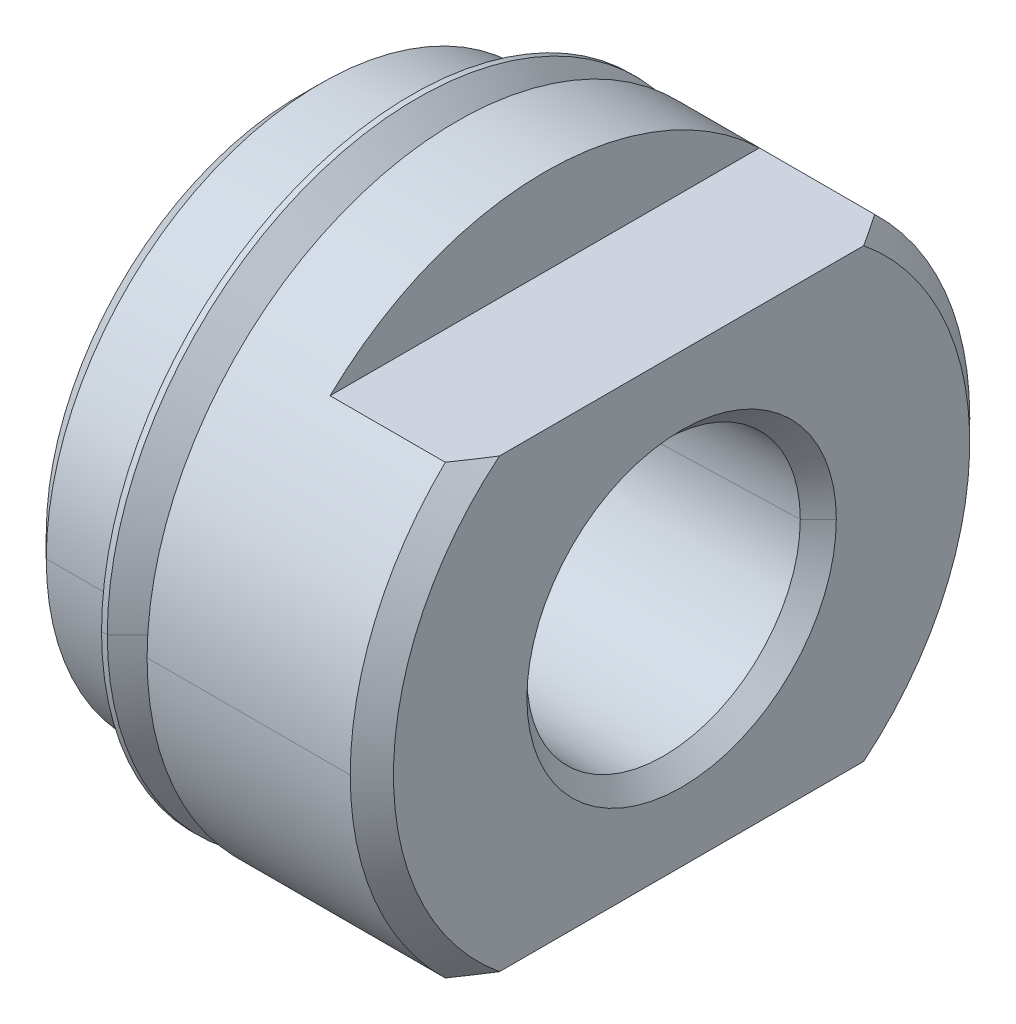
ISO-10303-21;
HEADER;
FILE_DESCRIPTION(('STEP AP214'),'2;1');
FILE_NAME('part.step','',(''),(''),'','','');
FILE_SCHEMA(('AUTOMOTIVE_DESIGN { 1 0 10303 214 1 1 1 1 }'));
ENDSEC;
DATA;
#1=APPLICATION_CONTEXT('core data for automotive mechanical design processes');
#2=APPLICATION_PROTOCOL_DEFINITION('international standard','automotive_design',2000,#1);
#3=PRODUCT_CONTEXT('',#1,'mechanical');
#4=PRODUCT('Part','Part','',(#3));
#5=PRODUCT_RELATED_PRODUCT_CATEGORY('part','',(#4));
#6=PRODUCT_DEFINITION_FORMATION('','',#4);
#7=PRODUCT_DEFINITION_CONTEXT('part definition',#1,'design');
#8=PRODUCT_DEFINITION('design','',#6,#7);
#9=PRODUCT_DEFINITION_SHAPE('','',#8);
#10=(LENGTH_UNIT() NAMED_UNIT(*) SI_UNIT(.MILLI.,.METRE.));
#11=(NAMED_UNIT(*) PLANE_ANGLE_UNIT() SI_UNIT($,.RADIAN.));
#12=(NAMED_UNIT(*) SI_UNIT($,.STERADIAN.) SOLID_ANGLE_UNIT());
#13=UNCERTAINTY_MEASURE_WITH_UNIT(LENGTH_MEASURE(1.E-05),#10,'distance_accuracy_value','');
#14=(GEOMETRIC_REPRESENTATION_CONTEXT(3) GLOBAL_UNCERTAINTY_ASSIGNED_CONTEXT((#13)) GLOBAL_UNIT_ASSIGNED_CONTEXT((#10,
#11,#12)) REPRESENTATION_CONTEXT('',''));
#15=CARTESIAN_POINT('',(0.,0.,0.));
#16=DIRECTION('',(0.,0.,1.));
#17=DIRECTION('',(1.,0.,0.));
#18=AXIS2_PLACEMENT_3D('',#15,#16,#17);
#19=CARTESIAN_POINT('',(8.6614,-7.874,21.844));
#20=DIRECTION('',(0.,-1.,0.));
#21=DIRECTION('',(0.,0.,-1.));
#22=AXIS2_PLACEMENT_3D('',#19,#20,#21);
#23=PLANE('',#22);
#24=DIRECTION('',(1.,0.,0.));
#25=VECTOR('',#24,1.);
#26=CARTESIAN_POINT('',(13.4874,-7.874,-7.56902952828169));
#27=LINE('',#26,#25);
#28=CARTESIAN_POINT('',(8.6614,-7.874,-7.56902952828169));
#29=VERTEX_POINT('',#28);
#30=CARTESIAN_POINT('',(12.7254,-7.874,-7.56902952828169));
#31=VERTEX_POINT('',#30);
#32=EDGE_CURVE('E11',#29,#31,#27,.T.);
#33=ORIENTED_EDGE('',*,*,#32,.T.);
#34=CARTESIAN_POINT('',(12.7254,-7.874,-7.56902952828168));
#35=CARTESIAN_POINT('',(12.9869753290344,-7.874,-7.19158011643322));
#36=CARTESIAN_POINT('',(13.2417852351289,-7.874,-6.80938092440114));
#37=CARTESIAN_POINT('',(13.4874,-7.874,-6.42072612716039));
#38=B_SPLINE_CURVE_WITH_KNOTS('',3,(#34,#35,#36,#37),.UNSPECIFIED.,.F.,.F.,(4,4),
(0.0200657069150868,0.0214499738718816),.UNSPECIFIED.);
#39=CARTESIAN_POINT('',(13.4874,-7.874,-6.42072612716039));
#40=VERTEX_POINT('',#39);
#41=EDGE_CURVE('E26',#31,#40,#38,.T.);
#42=ORIENTED_EDGE('',*,*,#41,.T.);
#43=DIRECTION('',(0.,0.,1.));
#44=VECTOR('',#43,1.);
#45=CARTESIAN_POINT('',(13.4874,-7.874,0.));
#46=LINE('',#45,#44);
#47=CARTESIAN_POINT('',(13.4874,-7.874,6.42072612716039));
#48=VERTEX_POINT('',#47);
#49=EDGE_CURVE('E182',#40,#48,#46,.T.);
#50=ORIENTED_EDGE('',*,*,#49,.T.);
#51=CARTESIAN_POINT('',(13.4874,-7.874,6.42072612716039));
#52=CARTESIAN_POINT('',(13.2416658865126,-7.874,6.80956977873295));
#53=CARTESIAN_POINT('',(12.9865070268508,-7.874,7.19225586970244));
#54=CARTESIAN_POINT('',(12.7254,-7.874,7.56902952828169));
#55=B_SPLINE_CURVE_WITH_KNOTS('',3,(#51,#52,#53,#54),.UNSPECIFIED.,.F.,.F.,(4,4),
(0.0351109925995823,0.0364702615939391),.UNSPECIFIED.);
#56=CARTESIAN_POINT('',(12.7254,-7.874,7.56902952828169));
#57=VERTEX_POINT('',#56);
#58=EDGE_CURVE('E1046',#48,#57,#55,.T.);
#59=ORIENTED_EDGE('',*,*,#58,.T.);
#60=DIRECTION('',(1.,0.,0.));
#61=VECTOR('',#60,1.);
#62=CARTESIAN_POINT('',(13.4874,-7.874,7.56902952828169));
#63=LINE('',#62,#61);
#64=CARTESIAN_POINT('',(8.6614,-7.874,7.56902952828169));
#65=VERTEX_POINT('',#64);
#66=EDGE_CURVE('E1041',#65,#57,#63,.T.);
#67=ORIENTED_EDGE('',*,*,#66,.F.);
#68=DIRECTION('',(0.,0.,-1.));
#69=VECTOR('',#68,1.);
#70=CARTESIAN_POINT('',(8.6614,-7.874,21.844));
#71=LINE('',#70,#69);
#72=EDGE_CURVE('E1037',#65,#29,#71,.T.);
#73=ORIENTED_EDGE('',*,*,#72,.T.);
#74=EDGE_LOOP('',(#33,#42,#50,#59,#67,#73));
#75=FACE_BOUND('',#74,.T.);
#76=ADVANCED_FACE('F17',(#75),#23,.T.);
#77=CARTESIAN_POINT('',(8.6614,0.,0.));
#78=DIRECTION('',(1.,0.,0.));
#79=DIRECTION('',(0.,0.,-1.));
#80=AXIS2_PLACEMENT_3D('',#77,#78,#79);
#81=PLANE('',#80);
#82=CARTESIAN_POINT('',(8.6614,0.,0.));
#83=DIRECTION('',(1.,0.,0.));
#84=DIRECTION('',(0.,0.,-1.));
#85=AXIS2_PLACEMENT_3D('',#82,#83,#84);
#86=CIRCLE('',#85,10.922);
#87=EDGE_CURVE('E1032',#65,#29,#86,.T.);
#88=ORIENTED_EDGE('',*,*,#87,.T.);
#89=ORIENTED_EDGE('',*,*,#72,.F.);
#90=EDGE_LOOP('',(#88,#89));
#91=FACE_BOUND('',#90,.T.);
#92=ADVANCED_FACE('F1118',(#91),#81,.T.);
#93=CARTESIAN_POINT('',(13.4874,0.,0.));
#94=DIRECTION('',(-1.,0.,0.));
#95=DIRECTION('',(0.,1.,0.));
#96=AXIS2_PLACEMENT_3D('',#93,#94,#95);
#97=CYLINDRICAL_SURFACE('',#96,10.922);
#98=CARTESIAN_POINT('',(5.5626,0.,0.));
#99=DIRECTION('',(1.,0.,0.));
#100=DIRECTION('',(0.,0.,-1.));
#101=AXIS2_PLACEMENT_3D('',#98,#99,#100);
#102=CIRCLE('',#101,10.922);
#103=CARTESIAN_POINT('',(5.5626,0.,10.922));
#104=VERTEX_POINT('',#103);
#105=CARTESIAN_POINT('',(5.5626,0.,-10.922));
#106=VERTEX_POINT('',#105);
#107=EDGE_CURVE('E1030',#104,#106,#102,.T.);
#108=ORIENTED_EDGE('',*,*,#107,.T.);
#109=CARTESIAN_POINT('',(12.7254,0.,-10.922));
#110=DIRECTION('',(-1.,0.,0.));
#111=VECTOR('',#110,1.);
#112=LINE('',#109,#111);
#113=CARTESIAN_POINT('',(12.7254,0.,-10.922));
#114=VERTEX_POINT('',#113);
#115=EDGE_CURVE('E978',#114,#106,#112,.T.);
#116=ORIENTED_EDGE('',*,*,#115,.F.);
#117=CARTESIAN_POINT('',(12.7254,0.,0.));
#118=DIRECTION('',(1.,0.,0.));
#119=DIRECTION('',(0.,0.,-1.));
#120=AXIS2_PLACEMENT_3D('',#117,#118,#119);
#121=CIRCLE('',#120,10.922);
#122=EDGE_CURVE('E1015',#31,#114,#121,.T.);
#123=ORIENTED_EDGE('',*,*,#122,.F.);
#124=ORIENTED_EDGE('',*,*,#32,.F.);
#125=ORIENTED_EDGE('',*,*,#87,.F.);
#126=ORIENTED_EDGE('',*,*,#66,.T.);
#127=CARTESIAN_POINT('',(12.7254,0.,0.));
#128=DIRECTION('',(1.,0.,0.));
#129=DIRECTION('',(0.,0.,-1.));
#130=AXIS2_PLACEMENT_3D('',#127,#128,#129);
#131=CIRCLE('',#130,10.922);
#132=CARTESIAN_POINT('',(12.7254,0.,10.922));
#133=VERTEX_POINT('',#132);
#134=EDGE_CURVE('E1012',#133,#57,#131,.T.);
#135=ORIENTED_EDGE('',*,*,#134,.F.);
#136=CARTESIAN_POINT('',(12.7254,0.,10.922));
#137=DIRECTION('',(-1.,0.,0.));
#138=VECTOR('',#137,1.);
#139=LINE('',#136,#138);
#140=EDGE_CURVE('E999',#133,#104,#139,.T.);
#141=ORIENTED_EDGE('',*,*,#140,.T.);
#142=EDGE_LOOP('',(#108,#116,#123,#124,#125,#126,#135,#141));
#143=FACE_BOUND('',#142,.T.);
#144=ADVANCED_FACE('F960',(#143),#97,.T.);
#145=CARTESIAN_POINT('',(13.4874,0.,0.));
#146=DIRECTION('',(-1.,0.,0.));
#147=DIRECTION('',(0.,-1.,0.));
#148=AXIS2_PLACEMENT_3D('',#145,#146,#147);
#149=CYLINDRICAL_SURFACE('',#148,10.922);
#150=CARTESIAN_POINT('',(12.7254,0.,0.));
#151=DIRECTION('',(1.,0.,0.));
#152=DIRECTION('',(0.,0.,-1.));
#153=AXIS2_PLACEMENT_3D('',#150,#151,#152);
#154=CIRCLE('',#153,10.922);
#155=CARTESIAN_POINT('',(12.7254,7.874,7.56902952828169));
#156=VERTEX_POINT('',#155);
#157=EDGE_CURVE('E994',#156,#133,#154,.T.);
#158=ORIENTED_EDGE('',*,*,#157,.F.);
#159=DIRECTION('',(1.,0.,0.));
#160=VECTOR('',#159,1.);
#161=CARTESIAN_POINT('',(13.4874,7.874,7.56902952828169));
#162=LINE('',#161,#160);
#163=CARTESIAN_POINT('',(8.6614,7.874,7.56902952828169));
#164=VERTEX_POINT('',#163);
#165=EDGE_CURVE('E990',#164,#156,#162,.T.);
#166=ORIENTED_EDGE('',*,*,#165,.F.);
#167=CARTESIAN_POINT('',(8.6614,0.,0.));
#168=DIRECTION('',(1.,0.,0.));
#169=DIRECTION('',(0.,0.,-1.));
#170=AXIS2_PLACEMENT_3D('',#167,#168,#169);
#171=CIRCLE('',#170,10.922);
#172=CARTESIAN_POINT('',(8.6614,7.874,-7.56902952828169));
#173=VERTEX_POINT('',#172);
#174=EDGE_CURVE('E985',#173,#164,#171,.T.);
#175=ORIENTED_EDGE('',*,*,#174,.F.);
#176=DIRECTION('',(1.,0.,0.));
#177=VECTOR('',#176,1.);
#178=CARTESIAN_POINT('',(13.4874,7.874,-7.56902952828169));
#179=LINE('',#178,#177);
#180=CARTESIAN_POINT('',(12.7254,7.874,-7.56902952828169));
#181=VERTEX_POINT('',#180);
#182=EDGE_CURVE('E981',#173,#181,#179,.T.);
#183=ORIENTED_EDGE('',*,*,#182,.T.);
#184=CARTESIAN_POINT('',(12.7254,0.,0.));
#185=DIRECTION('',(1.,0.,0.));
#186=DIRECTION('',(0.,0.,-1.));
#187=AXIS2_PLACEMENT_3D('',#184,#185,#186);
#188=CIRCLE('',#187,10.922);
#189=EDGE_CURVE('E193',#114,#181,#188,.T.);
#190=ORIENTED_EDGE('',*,*,#189,.F.);
#191=ORIENTED_EDGE('',*,*,#115,.T.);
#192=CARTESIAN_POINT('',(5.5626,0.,0.));
#193=DIRECTION('',(1.,0.,0.));
#194=DIRECTION('',(0.,0.,-1.));
#195=AXIS2_PLACEMENT_3D('',#192,#193,#194);
#196=CIRCLE('',#195,10.922);
#197=EDGE_CURVE('E941',#106,#104,#196,.T.);
#198=ORIENTED_EDGE('',*,*,#197,.T.);
#199=ORIENTED_EDGE('',*,*,#140,.F.);
#200=EDGE_LOOP('',(#158,#166,#175,#183,#190,#191,#198,#199));
#201=FACE_BOUND('',#200,.T.);
#202=ADVANCED_FACE('F950',(#201),#149,.T.);
#203=CARTESIAN_POINT('',(5.5626,8.9154,0.));
#204=DIRECTION('',(1.,0.,0.));
#205=DIRECTION('',(0.,0.,-1.));
#206=AXIS2_PLACEMENT_3D('',#203,#204,#205);
#207=PLANE('',#206);
#208=ORIENTED_EDGE('',*,*,#197,.F.);
#209=ORIENTED_EDGE('',*,*,#107,.F.);
#210=EDGE_LOOP('',(#208,#209));
#211=FACE_BOUND('',#210,.T.);
#212=CARTESIAN_POINT('',(5.5626,0.,0.));
#213=DIRECTION('',(1.,0.,0.));
#214=DIRECTION('',(0.,0.,-1.));
#215=AXIS2_PLACEMENT_3D('',#212,#213,#214);
#216=CIRCLE('',#215,9.51839893040249);
#217=CARTESIAN_POINT('',(5.5626,0.,-9.51839893040249));
#218=VERTEX_POINT('',#217);
#219=CARTESIAN_POINT('',(5.5626,0.,9.51839893040249));
#220=VERTEX_POINT('',#219);
#221=EDGE_CURVE('E937',#218,#220,#216,.T.);
#222=ORIENTED_EDGE('',*,*,#221,.T.);
#223=CARTESIAN_POINT('',(5.5626,0.,0.));
#224=DIRECTION('',(1.,0.,0.));
#225=DIRECTION('',(0.,0.,-1.));
#226=AXIS2_PLACEMENT_3D('',#223,#224,#225);
#227=CIRCLE('',#226,9.51839893040249);
#228=EDGE_CURVE('E933',#220,#218,#227,.T.);
#229=ORIENTED_EDGE('',*,*,#228,.T.);
#230=EDGE_LOOP('',(#222,#229));
#231=FACE_BOUND('',#230,.T.);
#232=ADVANCED_FACE('F959',(#211,#231),#207,.F.);
#233=CARTESIAN_POINT('',(6.1655989304025,0.,0.));
#234=DIRECTION('',(-1.,0.,0.));
#235=DIRECTION('',(0.,1.,0.));
#236=AXIS2_PLACEMENT_3D('',#233,#234,#235);
#237=CONICAL_SURFACE('',#236,8.9154,0.785398163397449);
#238=CARTESIAN_POINT('',(4.1589989304025,0.,0.));
#239=DIRECTION('',(1.,0.,0.));
#240=DIRECTION('',(0.,0.,-1.));
#241=AXIS2_PLACEMENT_3D('',#238,#239,#240);
#242=CIRCLE('',#241,10.922);
#243=CARTESIAN_POINT('',(4.1589989304025,0.,10.922));
#244=VERTEX_POINT('',#243);
#245=CARTESIAN_POINT('',(4.1589989304025,0.,-10.922));
#246=VERTEX_POINT('',#245);
#247=EDGE_CURVE('E931',#244,#246,#242,.T.);
#248=ORIENTED_EDGE('',*,*,#247,.T.);
#249=CARTESIAN_POINT('',(5.5626,0.,-9.5183989304025));
#250=DIRECTION('',(-0.707106781186547,0.,-0.707106781186548));
#251=VECTOR('',#250,1.);
#252=LINE('',#249,#251);
#253=EDGE_CURVE('E909',#218,#246,#252,.T.);
#254=ORIENTED_EDGE('',*,*,#253,.F.);
#255=ORIENTED_EDGE('',*,*,#228,.F.);
#256=CARTESIAN_POINT('',(5.5626,0.,9.5183989304025));
#257=DIRECTION('',(-0.707106781186547,0.,0.707106781186548));
#258=VECTOR('',#257,1.);
#259=LINE('',#256,#258);
#260=EDGE_CURVE('E921',#220,#244,#259,.T.);
#261=ORIENTED_EDGE('',*,*,#260,.T.);
#262=EDGE_LOOP('',(#248,#254,#255,#261));
#263=FACE_BOUND('',#262,.T.);
#264=ADVANCED_FACE('F888',(#263),#237,.T.);
#265=CARTESIAN_POINT('',(6.1655989304025,0.,0.));
#266=DIRECTION('',(-1.,0.,0.));
#267=DIRECTION('',(0.,-1.,0.));
#268=AXIS2_PLACEMENT_3D('',#265,#266,#267);
#269=CONICAL_SURFACE('',#268,8.9154,0.785398163397449);
#270=ORIENTED_EDGE('',*,*,#221,.F.);
#271=ORIENTED_EDGE('',*,*,#253,.T.);
#272=CARTESIAN_POINT('',(4.1589989304025,0.,0.));
#273=DIRECTION('',(1.,0.,0.));
#274=DIRECTION('',(0.,0.,-1.));
#275=AXIS2_PLACEMENT_3D('',#272,#273,#274);
#276=CIRCLE('',#275,10.922);
#277=EDGE_CURVE('E1457',#246,#244,#276,.T.);
#278=ORIENTED_EDGE('',*,*,#277,.T.);
#279=ORIENTED_EDGE('',*,*,#260,.F.);
#280=EDGE_LOOP('',(#270,#271,#278,#279));
#281=FACE_BOUND('',#280,.T.);
#282=ADVANCED_FACE('F879',(#281),#269,.T.);
#283=CARTESIAN_POINT('',(13.4874,0.,0.));
#284=DIRECTION('',(-1.,0.,0.));
#285=DIRECTION('',(0.,-1.,0.));
#286=AXIS2_PLACEMENT_3D('',#283,#284,#285);
#287=CYLINDRICAL_SURFACE('',#286,10.922);
#288=ORIENTED_EDGE('',*,*,#277,.F.);
#289=CARTESIAN_POINT('',(4.15899893040249,0.,-10.922));
#290=DIRECTION('',(-1.,0.,0.));
#291=VECTOR('',#290,1.);
#292=LINE('',#289,#291);
#293=CARTESIAN_POINT('',(3.9557989304025,0.,-10.922));
#294=VERTEX_POINT('',#293);
#295=EDGE_CURVE('E844',#246,#294,#292,.T.);
#296=ORIENTED_EDGE('',*,*,#295,.T.);
#297=CARTESIAN_POINT('',(3.9557989304025,0.,0.));
#298=DIRECTION('',(1.,0.,0.));
#299=DIRECTION('',(0.,0.,-1.));
#300=AXIS2_PLACEMENT_3D('',#297,#298,#299);
#301=CIRCLE('',#300,10.922);
#302=CARTESIAN_POINT('',(3.9557989304025,0.,10.922));
#303=VERTEX_POINT('',#302);
#304=EDGE_CURVE('E861',#294,#303,#301,.T.);
#305=ORIENTED_EDGE('',*,*,#304,.T.);
#306=CARTESIAN_POINT('',(4.15899893040249,0.,10.922));
#307=DIRECTION('',(-1.,0.,0.));
#308=VECTOR('',#307,1.);
#309=LINE('',#306,#308);
#310=EDGE_CURVE('E846',#244,#303,#309,.T.);
#311=ORIENTED_EDGE('',*,*,#310,.F.);
#312=EDGE_LOOP('',(#288,#296,#305,#311));
#313=FACE_BOUND('',#312,.T.);
#314=ADVANCED_FACE('F827',(#313),#287,.T.);
#315=CARTESIAN_POINT('',(13.4874,0.,0.));
#316=DIRECTION('',(-1.,0.,0.));
#317=DIRECTION('',(0.,1.,0.));
#318=AXIS2_PLACEMENT_3D('',#315,#316,#317);
#319=CYLINDRICAL_SURFACE('',#318,10.922);
#320=CARTESIAN_POINT('',(3.9557989304025,0.,0.));
#321=DIRECTION('',(1.,0.,0.));
#322=DIRECTION('',(0.,0.,-1.));
#323=AXIS2_PLACEMENT_3D('',#320,#321,#322);
#324=CIRCLE('',#323,10.922);
#325=EDGE_CURVE('E808',#303,#294,#324,.T.);
#326=ORIENTED_EDGE('',*,*,#325,.T.);
#327=ORIENTED_EDGE('',*,*,#295,.F.);
#328=ORIENTED_EDGE('',*,*,#247,.F.);
#329=ORIENTED_EDGE('',*,*,#310,.T.);
#330=EDGE_LOOP('',(#326,#327,#328,#329));
#331=FACE_BOUND('',#330,.T.);
#332=ADVANCED_FACE('F817',(#331),#319,.T.);
#333=CARTESIAN_POINT('',(3.9557989304025,10.922,0.));
#334=DIRECTION('',(-1.,0.,0.));
#335=DIRECTION('',(0.,0.,1.));
#336=AXIS2_PLACEMENT_3D('',#333,#334,#335);
#337=PLANE('',#336);
#338=CARTESIAN_POINT('',(3.9557989304025,0.,0.));
#339=DIRECTION('',(1.,0.,0.));
#340=DIRECTION('',(0.,0.,-1.));
#341=AXIS2_PLACEMENT_3D('',#338,#339,#340);
#342=CIRCLE('',#341,10.837831804126);
#343=CARTESIAN_POINT('',(3.9557989304025,0.,-10.837831804126));
#344=VERTEX_POINT('',#343);
#345=CARTESIAN_POINT('',(3.9557989304025,0.,10.837831804126));
#346=VERTEX_POINT('',#345);
#347=EDGE_CURVE('E804',#344,#346,#342,.T.);
#348=ORIENTED_EDGE('',*,*,#347,.T.);
#349=CARTESIAN_POINT('',(3.9557989304025,0.,0.));
#350=DIRECTION('',(1.,0.,0.));
#351=DIRECTION('',(0.,0.,-1.));
#352=AXIS2_PLACEMENT_3D('',#349,#350,#351);
#353=CIRCLE('',#352,10.837831804126);
#354=EDGE_CURVE('E802',#346,#344,#353,.T.);
#355=ORIENTED_EDGE('',*,*,#354,.T.);
#356=EDGE_LOOP('',(#348,#355));
#357=FACE_BOUND('',#356,.T.);
#358=ORIENTED_EDGE('',*,*,#304,.F.);
#359=ORIENTED_EDGE('',*,*,#325,.F.);
#360=EDGE_LOOP('',(#358,#359));
#361=FACE_BOUND('',#360,.T.);
#362=ADVANCED_FACE('F826',(#357,#361),#337,.T.);
#363=CARTESIAN_POINT('',(3.9557989304025,0.,0.));
#364=DIRECTION('',(-1.,0.,0.));
#365=DIRECTION('',(0.,1.,0.));
#366=AXIS2_PLACEMENT_3D('',#363,#364,#365);
#367=CONICAL_SURFACE('',#366,10.837831804126,0.7853981633975);
#368=ORIENTED_EDGE('',*,*,#354,.F.);
#369=CARTESIAN_POINT('',(5.56260000000001,0.,9.23103073452833));
#370=DIRECTION('',(-0.707106781186511,0.,0.707106781186584));
#371=VECTOR('',#370,1.);
#372=LINE('',#369,#371);
#373=CARTESIAN_POINT('',(5.56260000000001,0.,9.23103073452833));
#374=VERTEX_POINT('',#373);
#375=EDGE_CURVE('E772',#374,#346,#372,.T.);
#376=ORIENTED_EDGE('',*,*,#375,.F.);
#377=CARTESIAN_POINT('',(5.5626,0.,0.));
#378=DIRECTION('',(1.,0.,0.));
#379=DIRECTION('',(0.,0.,-1.));
#380=AXIS2_PLACEMENT_3D('',#377,#378,#379);
#381=CIRCLE('',#380,9.23103073452833);
#382=CARTESIAN_POINT('',(5.5626,0.,-9.23103073452833));
#383=VERTEX_POINT('',#382);
#384=EDGE_CURVE('E789',#374,#383,#381,.T.);
#385=ORIENTED_EDGE('',*,*,#384,.T.);
#386=CARTESIAN_POINT('',(5.56260000000001,0.,-9.23103073452833));
#387=DIRECTION('',(-0.707106781186511,0.,-0.707106781186584));
#388=VECTOR('',#387,1.);
#389=LINE('',#386,#388);
#390=EDGE_CURVE('E774',#383,#344,#389,.T.);
#391=ORIENTED_EDGE('',*,*,#390,.T.);
#392=EDGE_LOOP('',(#368,#376,#385,#391));
#393=FACE_BOUND('',#392,.T.);
#394=ADVANCED_FACE('F755',(#393),#367,.F.);
#395=CARTESIAN_POINT('',(3.9557989304025,0.,0.));
#396=DIRECTION('',(-1.,0.,0.));
#397=DIRECTION('',(0.,-1.,0.));
#398=AXIS2_PLACEMENT_3D('',#395,#396,#397);
#399=CONICAL_SURFACE('',#398,10.837831804126,0.7853981633975);
#400=CARTESIAN_POINT('',(5.5626,0.,0.));
#401=DIRECTION('',(1.,0.,0.));
#402=DIRECTION('',(0.,0.,-1.));
#403=AXIS2_PLACEMENT_3D('',#400,#401,#402);
#404=CIRCLE('',#403,9.23103073452833);
#405=EDGE_CURVE('E736',#383,#374,#404,.T.);
#406=ORIENTED_EDGE('',*,*,#405,.T.);
#407=ORIENTED_EDGE('',*,*,#375,.T.);
#408=ORIENTED_EDGE('',*,*,#347,.F.);
#409=ORIENTED_EDGE('',*,*,#390,.F.);
#410=EDGE_LOOP('',(#406,#407,#408,#409));
#411=FACE_BOUND('',#410,.T.);
#412=ADVANCED_FACE('F745',(#411),#399,.F.);
#413=CARTESIAN_POINT('',(5.5626,8.9154,0.));
#414=DIRECTION('',(1.,0.,0.));
#415=DIRECTION('',(0.,0.,-1.));
#416=AXIS2_PLACEMENT_3D('',#413,#414,#415);
#417=PLANE('',#416);
#418=ORIENTED_EDGE('',*,*,#405,.F.);
#419=ORIENTED_EDGE('',*,*,#384,.F.);
#420=EDGE_LOOP('',(#418,#419));
#421=FACE_BOUND('',#420,.T.);
#422=CARTESIAN_POINT('',(5.5626,0.,0.));
#423=DIRECTION('',(1.,0.,0.));
#424=DIRECTION('',(0.,0.,-1.));
#425=AXIS2_PLACEMENT_3D('',#422,#423,#424);
#426=CIRCLE('',#425,8.9154);
#427=CARTESIAN_POINT('',(5.5626,0.,-8.9154));
#428=VERTEX_POINT('',#427);
#429=CARTESIAN_POINT('',(5.5626,0.,8.9154));
#430=VERTEX_POINT('',#429);
#431=EDGE_CURVE('E732',#428,#430,#426,.T.);
#432=ORIENTED_EDGE('',*,*,#431,.T.);
#433=CARTESIAN_POINT('',(5.5626,0.,0.));
#434=DIRECTION('',(1.,0.,0.));
#435=DIRECTION('',(0.,0.,-1.));
#436=AXIS2_PLACEMENT_3D('',#433,#434,#435);
#437=CIRCLE('',#436,8.9154);
#438=EDGE_CURVE('E728',#430,#428,#437,.T.);
#439=ORIENTED_EDGE('',*,*,#438,.T.);
#440=EDGE_LOOP('',(#432,#439));
#441=FACE_BOUND('',#440,.T.);
#442=ADVANCED_FACE('F754',(#421,#441),#417,.F.);
#443=CARTESIAN_POINT('',(13.4874,0.,0.));
#444=DIRECTION('',(-1.,0.,0.));
#445=DIRECTION('',(0.,1.,0.));
#446=AXIS2_PLACEMENT_3D('',#443,#444,#445);
#447=CYLINDRICAL_SURFACE('',#446,8.9154);
#448=CARTESIAN_POINT('',(4.8006,0.,0.));
#449=DIRECTION('',(1.,0.,0.));
#450=DIRECTION('',(0.,0.,-1.));
#451=AXIS2_PLACEMENT_3D('',#448,#449,#450);
#452=CIRCLE('',#451,8.9154);
#453=CARTESIAN_POINT('',(4.8006,0.,8.9154));
#454=VERTEX_POINT('',#453);
#455=CARTESIAN_POINT('',(4.8006,0.,-8.9154));
#456=VERTEX_POINT('',#455);
#457=EDGE_CURVE('E726',#454,#456,#452,.T.);
#458=ORIENTED_EDGE('',*,*,#457,.T.);
#459=CARTESIAN_POINT('',(5.5626,0.,-8.9154));
#460=DIRECTION('',(-1.,0.,0.));
#461=VECTOR('',#460,1.);
#462=LINE('',#459,#461);
#463=EDGE_CURVE('E704',#428,#456,#462,.T.);
#464=ORIENTED_EDGE('',*,*,#463,.F.);
#465=ORIENTED_EDGE('',*,*,#438,.F.);
#466=CARTESIAN_POINT('',(5.5626,0.,8.9154));
#467=DIRECTION('',(-1.,0.,0.));
#468=VECTOR('',#467,1.);
#469=LINE('',#466,#468);
#470=EDGE_CURVE('E716',#430,#454,#469,.T.);
#471=ORIENTED_EDGE('',*,*,#470,.T.);
#472=EDGE_LOOP('',(#458,#464,#465,#471));
#473=FACE_BOUND('',#472,.T.);
#474=ADVANCED_FACE('F683',(#473),#447,.T.);
#475=CARTESIAN_POINT('',(13.4874,0.,0.));
#476=DIRECTION('',(-1.,0.,0.));
#477=DIRECTION('',(0.,-1.,0.));
#478=AXIS2_PLACEMENT_3D('',#475,#476,#477);
#479=CYLINDRICAL_SURFACE('',#478,8.9154);
#480=ORIENTED_EDGE('',*,*,#431,.F.);
#481=ORIENTED_EDGE('',*,*,#463,.T.);
#482=CARTESIAN_POINT('',(4.8006,0.,0.));
#483=DIRECTION('',(1.,0.,0.));
#484=DIRECTION('',(0.,0.,-1.));
#485=AXIS2_PLACEMENT_3D('',#482,#483,#484);
#486=CIRCLE('',#485,8.9154);
#487=EDGE_CURVE('E1450',#456,#454,#486,.T.);
#488=ORIENTED_EDGE('',*,*,#487,.T.);
#489=ORIENTED_EDGE('',*,*,#470,.F.);
#490=EDGE_LOOP('',(#480,#481,#488,#489));
#491=FACE_BOUND('',#490,.T.);
#492=ADVANCED_FACE('F674',(#491),#479,.T.);
#493=CARTESIAN_POINT('',(4.0386,0.,0.));
#494=DIRECTION('',(-1.,0.,0.));
#495=DIRECTION('',(0.,-1.,0.));
#496=AXIS2_PLACEMENT_3D('',#493,#494,#495);
#497=CONICAL_SURFACE('',#496,9.6774,0.785398163397448);
#498=ORIENTED_EDGE('',*,*,#487,.F.);
#499=CARTESIAN_POINT('',(4.8006,0.,-8.9154));
#500=DIRECTION('',(-0.707106781186548,0.,-0.707106781186547));
#501=VECTOR('',#500,1.);
#502=LINE('',#499,#501);
#503=CARTESIAN_POINT('',(4.0386,0.,-9.6774));
#504=VERTEX_POINT('',#503);
#505=EDGE_CURVE('E639',#456,#504,#502,.T.);
#506=ORIENTED_EDGE('',*,*,#505,.T.);
#507=CARTESIAN_POINT('',(4.0386,0.,0.));
#508=DIRECTION('',(1.,0.,0.));
#509=DIRECTION('',(0.,0.,-1.));
#510=AXIS2_PLACEMENT_3D('',#507,#508,#509);
#511=CIRCLE('',#510,9.6774);
#512=CARTESIAN_POINT('',(4.0386,0.,9.6774));
#513=VERTEX_POINT('',#512);
#514=EDGE_CURVE('E656',#504,#513,#511,.T.);
#515=ORIENTED_EDGE('',*,*,#514,.T.);
#516=CARTESIAN_POINT('',(4.8006,0.,8.9154));
#517=DIRECTION('',(-0.707106781186548,0.,0.707106781186547));
#518=VECTOR('',#517,1.);
#519=LINE('',#516,#518);
#520=EDGE_CURVE('E641',#454,#513,#519,.T.);
#521=ORIENTED_EDGE('',*,*,#520,.F.);
#522=EDGE_LOOP('',(#498,#506,#515,#521));
#523=FACE_BOUND('',#522,.T.);
#524=ADVANCED_FACE('F622',(#523),#497,.T.);
#525=CARTESIAN_POINT('',(4.0386,0.,0.));
#526=DIRECTION('',(-1.,0.,0.));
#527=DIRECTION('',(0.,1.,0.));
#528=AXIS2_PLACEMENT_3D('',#525,#526,#527);
#529=CONICAL_SURFACE('',#528,9.6774,0.785398163397448);
#530=CARTESIAN_POINT('',(4.0386,0.,0.));
#531=DIRECTION('',(1.,0.,0.));
#532=DIRECTION('',(0.,0.,-1.));
#533=AXIS2_PLACEMENT_3D('',#530,#531,#532);
#534=CIRCLE('',#533,9.6774);
#535=EDGE_CURVE('E605',#513,#504,#534,.T.);
#536=ORIENTED_EDGE('',*,*,#535,.T.);
#537=ORIENTED_EDGE('',*,*,#505,.F.);
#538=ORIENTED_EDGE('',*,*,#457,.F.);
#539=ORIENTED_EDGE('',*,*,#520,.T.);
#540=EDGE_LOOP('',(#536,#537,#538,#539));
#541=FACE_BOUND('',#540,.T.);
#542=ADVANCED_FACE('F613',(#541),#529,.T.);
#543=CARTESIAN_POINT('',(13.4874,0.,0.));
#544=DIRECTION('',(-1.,0.,0.));
#545=DIRECTION('',(0.,1.,0.));
#546=AXIS2_PLACEMENT_3D('',#543,#544,#545);
#547=CYLINDRICAL_SURFACE('',#546,9.6774);
#548=CARTESIAN_POINT('',(0.762,0.,0.));
#549=DIRECTION('',(1.,0.,0.));
#550=DIRECTION('',(0.,0.,-1.));
#551=AXIS2_PLACEMENT_3D('',#548,#549,#550);
#552=CIRCLE('',#551,9.6774);
#553=CARTESIAN_POINT('',(0.762,0.,9.6774));
#554=VERTEX_POINT('',#553);
#555=CARTESIAN_POINT('',(0.762,0.,-9.6774));
#556=VERTEX_POINT('',#555);
#557=EDGE_CURVE('E603',#554,#556,#552,.T.);
#558=ORIENTED_EDGE('',*,*,#557,.T.);
#559=CARTESIAN_POINT('',(4.0386,0.,-9.6774));
#560=DIRECTION('',(-1.,0.,0.));
#561=VECTOR('',#560,1.);
#562=LINE('',#559,#561);
#563=EDGE_CURVE('E581',#504,#556,#562,.T.);
#564=ORIENTED_EDGE('',*,*,#563,.F.);
#565=ORIENTED_EDGE('',*,*,#535,.F.);
#566=CARTESIAN_POINT('',(4.0386,0.,9.6774));
#567=DIRECTION('',(-1.,0.,0.));
#568=VECTOR('',#567,1.);
#569=LINE('',#566,#568);
#570=EDGE_CURVE('E593',#513,#554,#569,.T.);
#571=ORIENTED_EDGE('',*,*,#570,.T.);
#572=EDGE_LOOP('',(#558,#564,#565,#571));
#573=FACE_BOUND('',#572,.T.);
#574=ADVANCED_FACE('F560',(#573),#547,.T.);
#575=CARTESIAN_POINT('',(13.4874,0.,0.));
#576=DIRECTION('',(-1.,0.,0.));
#577=DIRECTION('',(0.,-1.,0.));
#578=AXIS2_PLACEMENT_3D('',#575,#576,#577);
#579=CYLINDRICAL_SURFACE('',#578,9.6774);
#580=ORIENTED_EDGE('',*,*,#514,.F.);
#581=ORIENTED_EDGE('',*,*,#563,.T.);
#582=CARTESIAN_POINT('',(0.762,0.,0.));
#583=DIRECTION('',(1.,0.,0.));
#584=DIRECTION('',(0.,0.,-1.));
#585=AXIS2_PLACEMENT_3D('',#582,#583,#584);
#586=CIRCLE('',#585,9.6774);
#587=EDGE_CURVE('E1449',#556,#554,#586,.T.);
#588=ORIENTED_EDGE('',*,*,#587,.T.);
#589=ORIENTED_EDGE('',*,*,#570,.F.);
#590=EDGE_LOOP('',(#580,#581,#588,#589));
#591=FACE_BOUND('',#590,.T.);
#592=ADVANCED_FACE('F551',(#591),#579,.T.);
#593=CARTESIAN_POINT('',(0.,0.,0.));
#594=DIRECTION('',(1.,0.,0.));
#595=DIRECTION('',(0.,-1.,0.));
#596=AXIS2_PLACEMENT_3D('',#593,#594,#595);
#597=CONICAL_SURFACE('',#596,8.9154,0.785398163397448);
#598=ORIENTED_EDGE('',*,*,#587,.F.);
#599=CARTESIAN_POINT('',(0.,0.,-8.9154));
#600=DIRECTION('',(0.707106781186548,0.,-0.707106781186547));
#601=VECTOR('',#600,1.);
#602=LINE('',#599,#601);
#603=CARTESIAN_POINT('',(0.,0.,-8.9154));
#604=VERTEX_POINT('',#603);
#605=EDGE_CURVE('E516',#604,#556,#602,.T.);
#606=ORIENTED_EDGE('',*,*,#605,.F.);
#607=CARTESIAN_POINT('',(0.,0.,0.));
#608=DIRECTION('',(1.,0.,0.));
#609=DIRECTION('',(0.,0.,-1.));
#610=AXIS2_PLACEMENT_3D('',#607,#608,#609);
#611=CIRCLE('',#610,8.9154);
#612=CARTESIAN_POINT('',(0.,0.,8.9154));
#613=VERTEX_POINT('',#612);
#614=EDGE_CURVE('E533',#604,#613,#611,.T.);
#615=ORIENTED_EDGE('',*,*,#614,.T.);
#616=CARTESIAN_POINT('',(0.,0.,8.9154));
#617=DIRECTION('',(0.707106781186548,0.,0.707106781186547));
#618=VECTOR('',#617,1.);
#619=LINE('',#616,#618);
#620=EDGE_CURVE('E518',#613,#554,#619,.T.);
#621=ORIENTED_EDGE('',*,*,#620,.T.);
#622=EDGE_LOOP('',(#598,#606,#615,#621));
#623=FACE_BOUND('',#622,.T.);
#624=ADVANCED_FACE('F499',(#623),#597,.T.);
#625=CARTESIAN_POINT('',(0.,0.,0.));
#626=DIRECTION('',(1.,0.,0.));
#627=DIRECTION('',(0.,1.,0.));
#628=AXIS2_PLACEMENT_3D('',#625,#626,#627);
#629=CONICAL_SURFACE('',#628,8.9154,0.785398163397448);
#630=CARTESIAN_POINT('',(0.,0.,0.));
#631=DIRECTION('',(1.,0.,0.));
#632=DIRECTION('',(0.,0.,-1.));
#633=AXIS2_PLACEMENT_3D('',#630,#631,#632);
#634=CIRCLE('',#633,8.9154);
#635=EDGE_CURVE('E480',#613,#604,#634,.T.);
#636=ORIENTED_EDGE('',*,*,#635,.T.);
#637=ORIENTED_EDGE('',*,*,#605,.T.);
#638=ORIENTED_EDGE('',*,*,#557,.F.);
#639=ORIENTED_EDGE('',*,*,#620,.F.);
#640=EDGE_LOOP('',(#636,#637,#638,#639));
#641=FACE_BOUND('',#640,.T.);
#642=ADVANCED_FACE('F489',(#641),#629,.T.);
#643=CARTESIAN_POINT('',(0.,0.,0.));
#644=DIRECTION('',(1.,0.,0.));
#645=DIRECTION('',(0.,0.,-1.));
#646=AXIS2_PLACEMENT_3D('',#643,#644,#645);
#647=PLANE('',#646);
#648=ORIENTED_EDGE('',*,*,#614,.F.);
#649=ORIENTED_EDGE('',*,*,#635,.F.);
#650=EDGE_LOOP('',(#648,#649));
#651=FACE_BOUND('',#650,.T.);
#652=CARTESIAN_POINT('',(0.,0.,0.));
#653=DIRECTION('',(1.,0.,0.));
#654=DIRECTION('',(0.,0.,-1.));
#655=AXIS2_PLACEMENT_3D('',#652,#653,#654);
#656=CIRCLE('',#655,6.604);
#657=CARTESIAN_POINT('',(0.,0.,-6.604));
#658=VERTEX_POINT('',#657);
#659=CARTESIAN_POINT('',(0.,0.,6.604));
#660=VERTEX_POINT('',#659);
#661=EDGE_CURVE('E476',#658,#660,#656,.T.);
#662=ORIENTED_EDGE('',*,*,#661,.T.);
#663=CARTESIAN_POINT('',(0.,0.,0.));
#664=DIRECTION('',(1.,0.,0.));
#665=DIRECTION('',(0.,0.,-1.));
#666=AXIS2_PLACEMENT_3D('',#663,#664,#665);
#667=CIRCLE('',#666,6.604);
#668=EDGE_CURVE('E474',#660,#658,#667,.T.);
#669=ORIENTED_EDGE('',*,*,#668,.T.);
#670=EDGE_LOOP('',(#662,#669));
#671=FACE_BOUND('',#670,.T.);
#672=ADVANCED_FACE('F498',(#651,#671),#647,.F.);
#673=CARTESIAN_POINT('',(0.,0.,0.));
#674=DIRECTION('',(-1.,0.,0.));
#675=DIRECTION('',(0.,1.,0.));
#676=AXIS2_PLACEMENT_3D('',#673,#674,#675);
#677=CONICAL_SURFACE('',#676,6.604,0.78539816339745);
#678=ORIENTED_EDGE('',*,*,#668,.F.);
#679=CARTESIAN_POINT('',(0.254,0.,6.35));
#680=DIRECTION('',(-0.707106781186546,0.,0.707106781186549));
#681=VECTOR('',#680,1.);
#682=LINE('',#679,#681);
#683=CARTESIAN_POINT('',(0.254,0.,6.35));
#684=VERTEX_POINT('',#683);
#685=EDGE_CURVE('E444',#684,#660,#682,.T.);
#686=ORIENTED_EDGE('',*,*,#685,.F.);
#687=CARTESIAN_POINT('',(0.254,0.,0.));
#688=DIRECTION('',(1.,0.,0.));
#689=DIRECTION('',(0.,0.,-1.));
#690=AXIS2_PLACEMENT_3D('',#687,#688,#689);
#691=CIRCLE('',#690,6.35);
#692=CARTESIAN_POINT('',(0.254,0.,-6.35));
#693=VERTEX_POINT('',#692);
#694=EDGE_CURVE('E461',#684,#693,#691,.T.);
#695=ORIENTED_EDGE('',*,*,#694,.T.);
#696=CARTESIAN_POINT('',(0.254,0.,-6.35));
#697=DIRECTION('',(-0.707106781186546,0.,-0.707106781186549));
#698=VECTOR('',#697,1.);
#699=LINE('',#696,#698);
#700=EDGE_CURVE('E446',#693,#658,#699,.T.);
#701=ORIENTED_EDGE('',*,*,#700,.T.);
#702=EDGE_LOOP('',(#678,#686,#695,#701));
#703=FACE_BOUND('',#702,.T.);
#704=ADVANCED_FACE('F427',(#703),#677,.F.);
#705=CARTESIAN_POINT('',(0.,0.,0.));
#706=DIRECTION('',(-1.,0.,0.));
#707=DIRECTION('',(0.,-1.,0.));
#708=AXIS2_PLACEMENT_3D('',#705,#706,#707);
#709=CONICAL_SURFACE('',#708,6.604,0.78539816339745);
#710=CARTESIAN_POINT('',(0.254,0.,0.));
#711=DIRECTION('',(1.,0.,0.));
#712=DIRECTION('',(0.,0.,-1.));
#713=AXIS2_PLACEMENT_3D('',#710,#711,#712);
#714=CIRCLE('',#713,6.35);
#715=EDGE_CURVE('E410',#693,#684,#714,.T.);
#716=ORIENTED_EDGE('',*,*,#715,.T.);
#717=ORIENTED_EDGE('',*,*,#685,.T.);
#718=ORIENTED_EDGE('',*,*,#661,.F.);
#719=ORIENTED_EDGE('',*,*,#700,.F.);
#720=EDGE_LOOP('',(#716,#717,#718,#719));
#721=FACE_BOUND('',#720,.T.);
#722=ADVANCED_FACE('F418',(#721),#709,.F.);
#723=CARTESIAN_POINT('',(6.35,0.,0.));
#724=DIRECTION('',(-1.,0.,0.));
#725=DIRECTION('',(0.,-1.,0.));
#726=AXIS2_PLACEMENT_3D('',#723,#724,#725);
#727=CYLINDRICAL_SURFACE('',#726,6.35);
#728=CARTESIAN_POINT('',(6.35,0.,0.));
#729=DIRECTION('',(1.,0.,0.));
#730=DIRECTION('',(0.,0.,-1.));
#731=AXIS2_PLACEMENT_3D('',#728,#729,#730);
#732=CIRCLE('',#731,6.35);
#733=CARTESIAN_POINT('',(6.35,0.,-6.35));
#734=VERTEX_POINT('',#733);
#735=CARTESIAN_POINT('',(6.35,0.,6.35));
#736=VERTEX_POINT('',#735);
#737=EDGE_CURVE('E408',#734,#736,#732,.T.);
#738=ORIENTED_EDGE('',*,*,#737,.T.);
#739=CARTESIAN_POINT('',(6.35,0.,6.35));
#740=DIRECTION('',(-1.,0.,0.));
#741=VECTOR('',#740,1.);
#742=LINE('',#739,#741);
#743=EDGE_CURVE('E385',#736,#684,#742,.T.);
#744=ORIENTED_EDGE('',*,*,#743,.T.);
#745=ORIENTED_EDGE('',*,*,#715,.F.);
#746=CARTESIAN_POINT('',(6.35,0.,-6.35));
#747=DIRECTION('',(-1.,0.,0.));
#748=VECTOR('',#747,1.);
#749=LINE('',#746,#748);
#750=EDGE_CURVE('E398',#734,#693,#749,.T.);
#751=ORIENTED_EDGE('',*,*,#750,.F.);
#752=EDGE_LOOP('',(#738,#744,#745,#751));
#753=FACE_BOUND('',#752,.T.);
#754=ADVANCED_FACE('F364',(#753),#727,.F.);
#755=CARTESIAN_POINT('',(6.35,0.,0.));
#756=DIRECTION('',(-1.,0.,0.));
#757=DIRECTION('',(0.,1.,0.));
#758=AXIS2_PLACEMENT_3D('',#755,#756,#757);
#759=CYLINDRICAL_SURFACE('',#758,6.35);
#760=ORIENTED_EDGE('',*,*,#694,.F.);
#761=ORIENTED_EDGE('',*,*,#743,.F.);
#762=CARTESIAN_POINT('',(6.35,0.,0.));
#763=DIRECTION('',(1.,0.,0.));
#764=DIRECTION('',(0.,0.,-1.));
#765=AXIS2_PLACEMENT_3D('',#762,#763,#764);
#766=CIRCLE('',#765,6.35);
#767=EDGE_CURVE('E345',#736,#734,#766,.T.);
#768=ORIENTED_EDGE('',*,*,#767,.T.);
#769=ORIENTED_EDGE('',*,*,#750,.T.);
#770=EDGE_LOOP('',(#760,#761,#768,#769));
#771=FACE_BOUND('',#770,.T.);
#772=ADVANCED_FACE('F354',(#771),#759,.F.);
#773=CARTESIAN_POINT('',(6.35,6.35,0.));
#774=DIRECTION('',(-1.,0.,0.));
#775=DIRECTION('',(0.,0.,1.));
#776=AXIS2_PLACEMENT_3D('',#773,#774,#775);
#777=PLANE('',#776);
#778=CARTESIAN_POINT('',(6.35,0.,0.));
#779=DIRECTION('',(1.,0.,0.));
#780=DIRECTION('',(0.,0.,-1.));
#781=AXIS2_PLACEMENT_3D('',#778,#779,#780);
#782=CIRCLE('',#781,4.61664956692591);
#783=CARTESIAN_POINT('',(6.35,0.,-4.61664956692591));
#784=VERTEX_POINT('',#783);
#785=CARTESIAN_POINT('',(6.35,0.,4.61664956692591));
#786=VERTEX_POINT('',#785);
#787=EDGE_CURVE('E341',#784,#786,#782,.T.);
#788=ORIENTED_EDGE('',*,*,#787,.T.);
#789=CARTESIAN_POINT('',(6.35,0.,0.));
#790=DIRECTION('',(1.,0.,0.));
#791=DIRECTION('',(0.,0.,-1.));
#792=AXIS2_PLACEMENT_3D('',#789,#790,#791);
#793=CIRCLE('',#792,4.61664956692591);
#794=EDGE_CURVE('E339',#786,#784,#793,.T.);
#795=ORIENTED_EDGE('',*,*,#794,.T.);
#796=EDGE_LOOP('',(#788,#795));
#797=FACE_BOUND('',#796,.T.);
#798=ORIENTED_EDGE('',*,*,#737,.F.);
#799=ORIENTED_EDGE('',*,*,#767,.F.);
#800=EDGE_LOOP('',(#798,#799));
#801=FACE_BOUND('',#800,.T.);
#802=ADVANCED_FACE('F363',(#797,#801),#777,.T.);
#803=CARTESIAN_POINT('',(6.35,0.,0.));
#804=DIRECTION('',(1.,0.,0.));
#805=DIRECTION('',(0.,1.,0.));
#806=AXIS2_PLACEMENT_3D('',#803,#804,#805);
#807=CONICAL_SURFACE('',#806,4.61664956692591,0.0312094049979857);
#808=ORIENTED_EDGE('',*,*,#794,.F.);
#809=CARTESIAN_POINT('',(6.35,0.,4.61664956692591));
#810=DIRECTION('',(0.999513026048907,0.,0.0312043387777431));
#811=VECTOR('',#810,1.);
#812=LINE('',#809,#811);
#813=CARTESIAN_POINT('',(12.852387191015,0.,4.8196511161649));
#814=VERTEX_POINT('',#813);
#815=EDGE_CURVE('E309',#786,#814,#812,.T.);
#816=ORIENTED_EDGE('',*,*,#815,.T.);
#817=CARTESIAN_POINT('',(12.852387191015,0.,0.));
#818=DIRECTION('',(1.,0.,0.));
#819=DIRECTION('',(0.,0.,-1.));
#820=AXIS2_PLACEMENT_3D('',#817,#818,#819);
#821=CIRCLE('',#820,4.8196511161649);
#822=CARTESIAN_POINT('',(12.852387191015,0.,-4.8196511161649));
#823=VERTEX_POINT('',#822);
#824=EDGE_CURVE('E326',#814,#823,#821,.T.);
#825=ORIENTED_EDGE('',*,*,#824,.T.);
#826=CARTESIAN_POINT('',(6.35,0.,-4.61664956692591));
#827=DIRECTION('',(0.999513026048907,0.,-0.0312043387777431));
#828=VECTOR('',#827,1.);
#829=LINE('',#826,#828);
#830=EDGE_CURVE('E311',#784,#823,#829,.T.);
#831=ORIENTED_EDGE('',*,*,#830,.F.);
#832=EDGE_LOOP('',(#808,#816,#825,#831));
#833=FACE_BOUND('',#832,.T.);
#834=ADVANCED_FACE('F292',(#833),#807,.F.);
#835=CARTESIAN_POINT('',(6.35,0.,0.));
#836=DIRECTION('',(1.,0.,0.));
#837=DIRECTION('',(0.,-1.,0.));
#838=AXIS2_PLACEMENT_3D('',#835,#836,#837);
#839=CONICAL_SURFACE('',#838,4.61664956692591,0.0312094049979857);
#840=CARTESIAN_POINT('',(12.852387191015,0.,0.));
#841=DIRECTION('',(1.,0.,0.));
#842=DIRECTION('',(0.,0.,-1.));
#843=AXIS2_PLACEMENT_3D('',#840,#841,#842);
#844=CIRCLE('',#843,4.8196511161649);
#845=EDGE_CURVE('E275',#823,#814,#844,.T.);
#846=ORIENTED_EDGE('',*,*,#845,.T.);
#847=ORIENTED_EDGE('',*,*,#815,.F.);
#848=ORIENTED_EDGE('',*,*,#787,.F.);
#849=ORIENTED_EDGE('',*,*,#830,.T.);
#850=EDGE_LOOP('',(#846,#847,#848,#849));
#851=FACE_BOUND('',#850,.T.);
#852=ADVANCED_FACE('F283',(#851),#839,.F.);
#853=CARTESIAN_POINT('',(12.852387191015,0.,0.));
#854=DIRECTION('',(1.,0.,0.));
#855=DIRECTION('',(0.,-1.,0.));
#856=AXIS2_PLACEMENT_3D('',#853,#854,#855);
#857=CONICAL_SURFACE('',#856,4.8196511161649,0.785398163397683);
#858=CARTESIAN_POINT('',(13.4874,0.,0.));
#859=DIRECTION('',(1.,0.,0.));
#860=DIRECTION('',(0.,0.,-1.));
#861=AXIS2_PLACEMENT_3D('',#858,#859,#860);
#862=CIRCLE('',#861,5.4546639251502);
#863=CARTESIAN_POINT('',(13.4874,0.,-5.4546639251502));
#864=VERTEX_POINT('',#863);
#865=CARTESIAN_POINT('',(13.4874,0.,5.4546639251502));
#866=VERTEX_POINT('',#865);
#867=EDGE_CURVE('E273',#864,#866,#862,.T.);
#868=ORIENTED_EDGE('',*,*,#867,.T.);
#869=CARTESIAN_POINT('',(12.852387191015,0.,4.8196511161649));
#870=DIRECTION('',(0.707106781186381,0.,0.707106781186714));
#871=VECTOR('',#870,1.);
#872=LINE('',#869,#871);
#873=EDGE_CURVE('E251',#814,#866,#872,.T.);
#874=ORIENTED_EDGE('',*,*,#873,.F.);
#875=ORIENTED_EDGE('',*,*,#845,.F.);
#876=CARTESIAN_POINT('',(12.852387191015,0.,-4.8196511161649));
#877=DIRECTION('',(0.707106781186381,0.,-0.707106781186714));
#878=VECTOR('',#877,1.);
#879=LINE('',#876,#878);
#880=EDGE_CURVE('E207',#823,#864,#879,.T.);
#881=ORIENTED_EDGE('',*,*,#880,.T.);
#882=EDGE_LOOP('',(#868,#874,#875,#881));
#883=FACE_BOUND('',#882,.T.);
#884=ADVANCED_FACE('F230',(#883),#857,.F.);
#885=CARTESIAN_POINT('',(12.852387191015,0.,0.));
#886=DIRECTION('',(1.,0.,0.));
#887=DIRECTION('',(0.,1.,0.));
#888=AXIS2_PLACEMENT_3D('',#885,#886,#887);
#889=CONICAL_SURFACE('',#888,4.8196511161649,0.785398163397683);
#890=ORIENTED_EDGE('',*,*,#824,.F.);
#891=ORIENTED_EDGE('',*,*,#873,.T.);
#892=CARTESIAN_POINT('',(13.4874,0.,0.));
#893=DIRECTION('',(1.,0.,0.));
#894=DIRECTION('',(0.,0.,-1.));
#895=AXIS2_PLACEMENT_3D('',#892,#893,#894);
#896=CIRCLE('',#895,5.4546639251502);
#897=EDGE_CURVE('E204',#866,#864,#896,.T.);
#898=ORIENTED_EDGE('',*,*,#897,.T.);
#899=ORIENTED_EDGE('',*,*,#880,.F.);
#900=EDGE_LOOP('',(#890,#891,#898,#899));
#901=FACE_BOUND('',#900,.T.);
#902=ADVANCED_FACE('F220',(#901),#889,.F.);
#903=CARTESIAN_POINT('',(13.4874,10.16,0.));
#904=DIRECTION('',(-1.,0.,0.));
#905=DIRECTION('',(0.,0.,1.));
#906=AXIS2_PLACEMENT_3D('',#903,#904,#905);
#907=PLANE('',#906);
#908=ORIENTED_EDGE('',*,*,#867,.F.);
#909=ORIENTED_EDGE('',*,*,#897,.F.);
#910=EDGE_LOOP('',(#908,#909));
#911=FACE_BOUND('',#910,.T.);
#912=DIRECTION('',(0.,0.,-1.));
#913=VECTOR('',#912,1.);
#914=CARTESIAN_POINT('',(13.4874,7.874,0.));
#915=LINE('',#914,#913);
#916=CARTESIAN_POINT('',(13.4874,7.874,6.42072612716039));
#917=VERTEX_POINT('',#916);
#918=CARTESIAN_POINT('',(13.4874,7.874,-6.42072612716039));
#919=VERTEX_POINT('',#918);
#920=EDGE_CURVE('E180',#917,#919,#915,.T.);
#921=ORIENTED_EDGE('',*,*,#920,.F.);
#922=CARTESIAN_POINT('',(13.4874,0.,0.));
#923=DIRECTION('',(1.,0.,0.));
#924=DIRECTION('',(0.,0.,-1.));
#925=AXIS2_PLACEMENT_3D('',#922,#923,#924);
#926=CIRCLE('',#925,10.16);
#927=EDGE_CURVE('E184',#917,#48,#926,.T.);
#928=ORIENTED_EDGE('',*,*,#927,.T.);
#929=ORIENTED_EDGE('',*,*,#49,.F.);
#930=CARTESIAN_POINT('',(13.4874,0.,0.));
#931=DIRECTION('',(1.,0.,0.));
#932=DIRECTION('',(0.,0.,-1.));
#933=AXIS2_PLACEMENT_3D('',#930,#931,#932);
#934=CIRCLE('',#933,10.16);
#935=EDGE_CURVE('E175',#40,#919,#934,.T.);
#936=ORIENTED_EDGE('',*,*,#935,.T.);
#937=EDGE_LOOP('',(#921,#928,#929,#936));
#938=FACE_BOUND('',#937,.T.);
#939=ADVANCED_FACE('F177',(#911,#938),#907,.F.);
#940=CARTESIAN_POINT('',(12.7254,0.,0.));
#941=DIRECTION('',(-1.,0.,0.));
#942=DIRECTION('',(0.,0.,1.));
#943=AXIS2_PLACEMENT_3D('',#940,#941,#942);
#944=CONICAL_SURFACE('',#943,10.922,0.78539816339745);
#945=CARTESIAN_POINT('',(13.4874,7.874,-6.42072612716039));
#946=CARTESIAN_POINT('',(13.2416658865126,7.874,-6.80956977873295));
#947=CARTESIAN_POINT('',(12.9865070268508,7.874,-7.19225586970244));
#948=CARTESIAN_POINT('',(12.7254,7.874,-7.56902952828169));
#949=B_SPLINE_CURVE_WITH_KNOTS('',3,(#945,#946,#947,#948),.UNSPECIFIED.,.F.,.F.,(4,4),
(0.0351109925995823,0.0364702615939391),.UNSPECIFIED.);
#950=EDGE_CURVE('E185',#919,#181,#949,.T.);
#951=ORIENTED_EDGE('',*,*,#950,.F.);
#952=ORIENTED_EDGE('',*,*,#935,.F.);
#953=ORIENTED_EDGE('',*,*,#41,.F.);
#954=ORIENTED_EDGE('',*,*,#122,.T.);
#955=ORIENTED_EDGE('',*,*,#189,.T.);
#956=EDGE_LOOP('',(#951,#952,#953,#954,#955));
#957=FACE_BOUND('',#956,.T.);
#958=ADVANCED_FACE('F190',(#957),#944,.T.);
#959=CARTESIAN_POINT('',(8.6614,7.874,-21.844));
#960=DIRECTION('',(0.,1.,0.));
#961=DIRECTION('',(0.,0.,1.));
#962=AXIS2_PLACEMENT_3D('',#959,#960,#961);
#963=PLANE('',#962);
#964=ORIENTED_EDGE('',*,*,#165,.T.);
#965=CARTESIAN_POINT('',(12.7254,7.874,7.56902952828168));
#966=CARTESIAN_POINT('',(12.9869753290344,7.874,7.19158011643322));
#967=CARTESIAN_POINT('',(13.2417852351289,7.874,6.80938092440114));
#968=CARTESIAN_POINT('',(13.4874,7.874,6.42072612716039));
#969=B_SPLINE_CURVE_WITH_KNOTS('',3,(#965,#966,#967,#968),.UNSPECIFIED.,.F.,.F.,(4,4),
(0.0200657069150868,0.0214499738718816),.UNSPECIFIED.);
#970=EDGE_CURVE('E197',#156,#917,#969,.T.);
#971=ORIENTED_EDGE('',*,*,#970,.T.);
#972=ORIENTED_EDGE('',*,*,#920,.T.);
#973=ORIENTED_EDGE('',*,*,#950,.T.);
#974=ORIENTED_EDGE('',*,*,#182,.F.);
#975=DIRECTION('',(0.,0.,1.));
#976=VECTOR('',#975,1.);
#977=CARTESIAN_POINT('',(8.6614,7.874,-21.844));
#978=LINE('',#977,#976);
#979=EDGE_CURVE('E1111',#173,#164,#978,.T.);
#980=ORIENTED_EDGE('',*,*,#979,.T.);
#981=EDGE_LOOP('',(#964,#971,#972,#973,#974,#980));
#982=FACE_BOUND('',#981,.T.);
#983=ADVANCED_FACE('F200',(#982),#963,.T.);
#984=CARTESIAN_POINT('',(8.6614,0.,0.));
#985=DIRECTION('',(1.,0.,0.));
#986=DIRECTION('',(0.,0.,-1.));
#987=AXIS2_PLACEMENT_3D('',#984,#985,#986);
#988=PLANE('',#987);
#989=ORIENTED_EDGE('',*,*,#979,.F.);
#990=ORIENTED_EDGE('',*,*,#174,.T.);
#991=EDGE_LOOP('',(#989,#990));
#992=FACE_BOUND('',#991,.T.);
#993=ADVANCED_FACE('F1089',(#992),#988,.T.);
#994=CARTESIAN_POINT('',(12.7254,0.,0.));
#995=DIRECTION('',(-1.,0.,0.));
#996=DIRECTION('',(0.,0.,-1.));
#997=AXIS2_PLACEMENT_3D('',#994,#995,#996);
#998=CONICAL_SURFACE('',#997,10.922,0.78539816339745);
#999=ORIENTED_EDGE('',*,*,#970,.F.);
#1000=ORIENTED_EDGE('',*,*,#157,.T.);
#1001=ORIENTED_EDGE('',*,*,#134,.T.);
#1002=ORIENTED_EDGE('',*,*,#58,.F.);
#1003=ORIENTED_EDGE('',*,*,#927,.F.);
#1004=EDGE_LOOP('',(#999,#1000,#1001,#1002,#1003));
#1005=FACE_BOUND('',#1004,.T.);
#1006=ADVANCED_FACE('F1071',(#1005),#998,.T.);
#1007=CLOSED_SHELL('',(#76,#92,#144,#202,#232,#264,#282,#314,#332,#362,#394,#412,#442,#474,#492,
#524,#542,#574,#592,#624,#642,#672,#704,#722,#754,#772,#802,#834,#852,#884,#902,#939,#958,#983,
#993,#1006));
#1008=MANIFOLD_SOLID_BREP('B1',#1007);
#1009=ADVANCED_BREP_SHAPE_REPRESENTATION('',(#18,#1008),#14);
#1010=SHAPE_DEFINITION_REPRESENTATION(#9,#1009);
ENDSEC;
END-ISO-10303-21;
